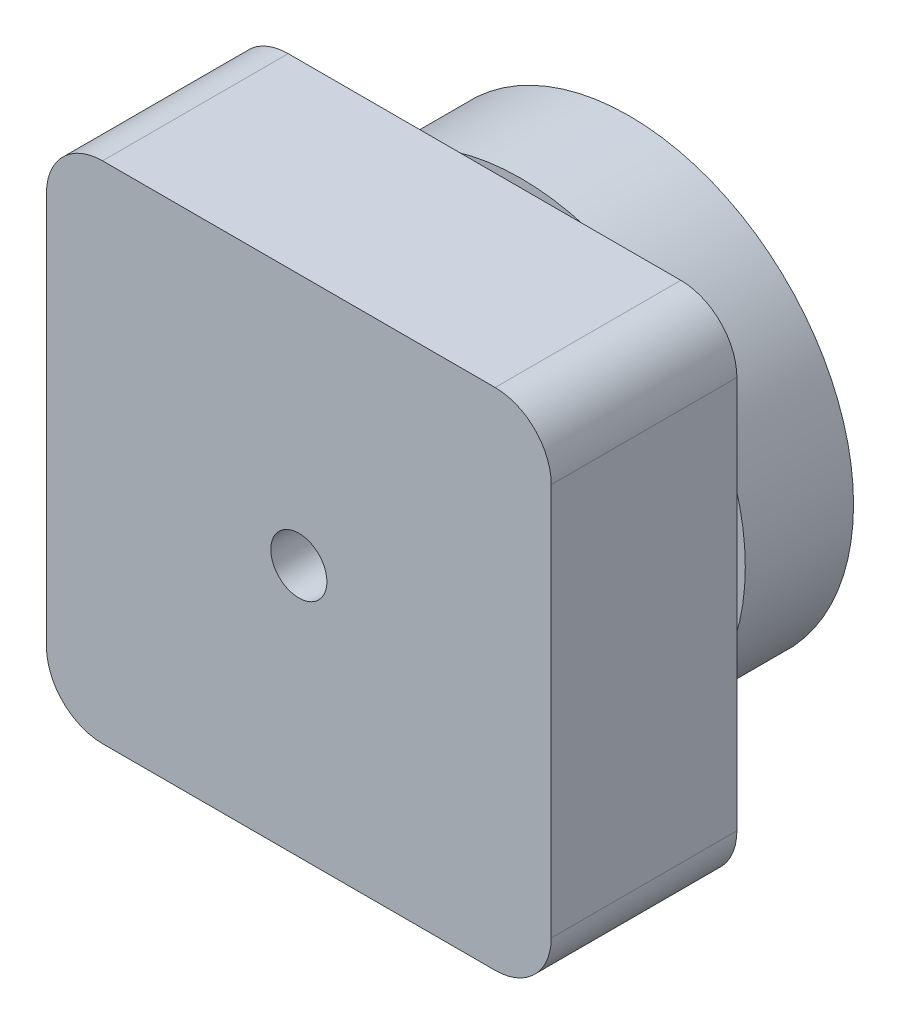
ISO-10303-21;
HEADER;
FILE_DESCRIPTION(('STEP AP214'),'2;1');
FILE_NAME('part.step','',(''),(''),'','','');
FILE_SCHEMA(('AUTOMOTIVE_DESIGN { 1 0 10303 214 1 1 1 1 }'));
ENDSEC;
DATA;
#1=APPLICATION_CONTEXT('core data for automotive mechanical design processes');
#2=APPLICATION_PROTOCOL_DEFINITION('international standard','automotive_design',2000,#1);
#3=PRODUCT_CONTEXT('',#1,'mechanical');
#4=PRODUCT('Part','Part','',(#3));
#5=PRODUCT_RELATED_PRODUCT_CATEGORY('part','',(#4));
#6=PRODUCT_DEFINITION_FORMATION('','',#4);
#7=PRODUCT_DEFINITION_CONTEXT('part definition',#1,'design');
#8=PRODUCT_DEFINITION('design','',#6,#7);
#9=PRODUCT_DEFINITION_SHAPE('','',#8);
#10=(LENGTH_UNIT() NAMED_UNIT(*) SI_UNIT(.MILLI.,.METRE.));
#11=(NAMED_UNIT(*) PLANE_ANGLE_UNIT() SI_UNIT($,.RADIAN.));
#12=(NAMED_UNIT(*) SI_UNIT($,.STERADIAN.) SOLID_ANGLE_UNIT());
#13=UNCERTAINTY_MEASURE_WITH_UNIT(LENGTH_MEASURE(1.E-05),#10,'distance_accuracy_value','');
#14=(GEOMETRIC_REPRESENTATION_CONTEXT(3) GLOBAL_UNCERTAINTY_ASSIGNED_CONTEXT((#13)) GLOBAL_UNIT_ASSIGNED_CONTEXT((#10,
#11,#12)) REPRESENTATION_CONTEXT('',''));
#15=CARTESIAN_POINT('',(0.,0.,0.));
#16=DIRECTION('',(0.,0.,1.));
#17=DIRECTION('',(1.,0.,0.));
#18=AXIS2_PLACEMENT_3D('',#15,#16,#17);
#19=CARTESIAN_POINT('',(40.,0.,-6.5));
#20=DIRECTION('',(0.,0.,1.));
#21=DIRECTION('',(0.,-1.,0.));
#22=AXIS2_PLACEMENT_3D('',#19,#20,#21);
#23=PLANE('',#22);
#24=CARTESIAN_POINT('',(0.,0.,-6.5));
#25=DIRECTION('',(0.,0.,-1.));
#26=DIRECTION('',(0.,1.,0.));
#27=AXIS2_PLACEMENT_3D('',#24,#25,#26);
#28=CIRCLE('',#27,40.);
#29=CARTESIAN_POINT('',(0.,40.,-6.5));
#30=VERTEX_POINT('',#29);
#31=EDGE_CURVE('E190',#30,#30,#28,.T.);
#32=ORIENTED_EDGE('',*,*,#31,.F.);
#33=EDGE_LOOP('',(#32));
#34=FACE_BOUND('',#33,.T.);
#35=CARTESIAN_POINT('',(0.,0.,-6.5));
#36=DIRECTION('',(0.,0.,1.));
#37=DIRECTION('',(1.,0.,0.));
#38=AXIS2_PLACEMENT_3D('',#35,#36,#37);
#39=CIRCLE('',#38,20.);
#40=CARTESIAN_POINT('',(20.,0.,-6.5));
#41=VERTEX_POINT('',#40);
#42=EDGE_CURVE('E181',#41,#41,#39,.T.);
#43=ORIENTED_EDGE('',*,*,#42,.F.);
#44=EDGE_LOOP('',(#43));
#45=FACE_BOUND('',#44,.T.);
#46=ADVANCED_FACE('F36',(#34,#45),#23,.T.);
#47=CARTESIAN_POINT('',(0.,0.,-6.5));
#48=DIRECTION('',(0.,0.,-1.));
#49=DIRECTION('',(0.,1.,0.));
#50=AXIS2_PLACEMENT_3D('',#47,#48,#49);
#51=CYLINDRICAL_SURFACE('',#50,40.);
#52=ORIENTED_EDGE('',*,*,#31,.T.);
#53=EDGE_LOOP('',(#52));
#54=FACE_BOUND('',#53,.T.);
#55=CARTESIAN_POINT('',(0.,0.,-25.8));
#56=DIRECTION('',(0.,0.,-1.));
#57=DIRECTION('',(0.,1.,0.));
#58=AXIS2_PLACEMENT_3D('',#55,#56,#57);
#59=CIRCLE('',#58,40.);
#60=CARTESIAN_POINT('',(0.,40.,-25.8));
#61=VERTEX_POINT('',#60);
#62=EDGE_CURVE('E185',#61,#61,#59,.T.);
#63=ORIENTED_EDGE('',*,*,#62,.F.);
#64=EDGE_LOOP('',(#63));
#65=FACE_BOUND('',#64,.T.);
#66=ADVANCED_FACE('F253',(#54,#65),#51,.T.);
#67=CARTESIAN_POINT('',(0.,0.,-25.8));
#68=DIRECTION('',(0.,0.,-1.));
#69=DIRECTION('',(0.,1.,0.));
#70=AXIS2_PLACEMENT_3D('',#67,#68,#69);
#71=PLANE('',#70);
#72=CARTESIAN_POINT('',(0.,0.,-25.8));
#73=DIRECTION('',(0.,0.,1.));
#74=DIRECTION('',(1.,0.,0.));
#75=AXIS2_PLACEMENT_3D('',#72,#73,#74);
#76=CIRCLE('',#75,5.);
#77=CARTESIAN_POINT('',(5.,0.,-25.8));
#78=VERTEX_POINT('',#77);
#79=EDGE_CURVE('E178',#78,#78,#76,.T.);
#80=ORIENTED_EDGE('',*,*,#79,.T.);
#81=EDGE_LOOP('',(#80));
#82=FACE_BOUND('',#81,.T.);
#83=ORIENTED_EDGE('',*,*,#62,.T.);
#84=EDGE_LOOP('',(#83));
#85=FACE_BOUND('',#84,.T.);
#86=ADVANCED_FACE('F259',(#82,#85),#71,.T.);
#87=CARTESIAN_POINT('',(0.,0.,0.));
#88=DIRECTION('',(0.,0.,-1.));
#89=DIRECTION('',(-1.,0.,0.));
#90=AXIS2_PLACEMENT_3D('',#87,#88,#89);
#91=CYLINDRICAL_SURFACE('',#90,20.);
#92=CARTESIAN_POINT('',(0.,0.,0.));
#93=DIRECTION('',(0.,0.,1.));
#94=DIRECTION('',(1.,0.,0.));
#95=AXIS2_PLACEMENT_3D('',#92,#93,#94);
#96=CIRCLE('',#95,20.);
#97=CARTESIAN_POINT('',(20.,0.,0.));
#98=VERTEX_POINT('',#97);
#99=EDGE_CURVE('E182',#98,#98,#96,.T.);
#100=ORIENTED_EDGE('',*,*,#99,.F.);
#101=EDGE_LOOP('',(#100));
#102=FACE_BOUND('',#101,.T.);
#103=ORIENTED_EDGE('',*,*,#42,.T.);
#104=EDGE_LOOP('',(#103));
#105=FACE_BOUND('',#104,.T.);
#106=ADVANCED_FACE('F361',(#102,#105),#91,.T.);
#107=CARTESIAN_POINT('',(0.,0.,0.));
#108=DIRECTION('',(0.,0.,1.));
#109=DIRECTION('',(1.,0.,0.));
#110=AXIS2_PLACEMENT_3D('',#107,#108,#109);
#111=CYLINDRICAL_SURFACE('',#110,5.00000000000001);
#112=ORIENTED_EDGE('',*,*,#79,.F.);
#113=EDGE_LOOP('',(#112));
#114=FACE_BOUND('',#113,.T.);
#115=CARTESIAN_POINT('',(0.,0.,-4.));
#116=DIRECTION('',(0.,0.,1.));
#117=DIRECTION('',(1.,0.,0.));
#118=AXIS2_PLACEMENT_3D('',#115,#116,#117);
#119=CIRCLE('',#118,5.00000000000001);
#120=CARTESIAN_POINT('',(5.00000000000001,0.,-4.));
#121=VERTEX_POINT('',#120);
#122=EDGE_CURVE('E175',#121,#121,#119,.T.);
#123=ORIENTED_EDGE('',*,*,#122,.T.);
#124=EDGE_LOOP('',(#123));
#125=FACE_BOUND('',#124,.T.);
#126=ADVANCED_FACE('F358',(#114,#125),#111,.F.);
#127=CARTESIAN_POINT('',(5.00000000000001,0.,-4.));
#128=DIRECTION('',(0.,0.,-1.));
#129=DIRECTION('',(-1.,0.,0.));
#130=AXIS2_PLACEMENT_3D('',#127,#128,#129);
#131=PLANE('',#130);
#132=ORIENTED_EDGE('',*,*,#122,.F.);
#133=EDGE_LOOP('',(#132));
#134=FACE_BOUND('',#133,.T.);
#135=CARTESIAN_POINT('',(0.,0.,-4.));
#136=DIRECTION('',(0.,0.,1.));
#137=DIRECTION('',(1.,0.,0.));
#138=AXIS2_PLACEMENT_3D('',#135,#136,#137);
#139=CIRCLE('',#138,10.);
#140=CARTESIAN_POINT('',(10.,0.,-4.));
#141=VERTEX_POINT('',#140);
#142=EDGE_CURVE('E172',#141,#141,#139,.T.);
#143=ORIENTED_EDGE('',*,*,#142,.T.);
#144=EDGE_LOOP('',(#143));
#145=FACE_BOUND('',#144,.T.);
#146=ADVANCED_FACE('F354',(#134,#145),#131,.F.);
#147=CARTESIAN_POINT('',(0.,0.,0.));
#148=DIRECTION('',(0.,0.,1.));
#149=DIRECTION('',(1.,0.,0.));
#150=AXIS2_PLACEMENT_3D('',#147,#148,#149);
#151=CYLINDRICAL_SURFACE('',#150,10.);
#152=ORIENTED_EDGE('',*,*,#142,.F.);
#153=EDGE_LOOP('',(#152));
#154=FACE_BOUND('',#153,.T.);
#155=CARTESIAN_POINT('',(0.,0.,0.));
#156=DIRECTION('',(0.,0.,-1.));
#157=DIRECTION('',(-1.,0.,0.));
#158=AXIS2_PLACEMENT_3D('',#155,#156,#157);
#159=CIRCLE('',#158,10.);
#160=CARTESIAN_POINT('',(-10.,0.,0.));
#161=VERTEX_POINT('',#160);
#162=EDGE_CURVE('E154',#161,#161,#159,.F.);
#163=ORIENTED_EDGE('',*,*,#162,.T.);
#164=EDGE_LOOP('',(#163));
#165=FACE_BOUND('',#164,.T.);
#166=ADVANCED_FACE('F293',(#154,#165),#151,.F.);
#167=CARTESIAN_POINT('',(0.,0.,0.));
#168=DIRECTION('',(0.,0.,-1.));
#169=DIRECTION('',(-1.,0.,0.));
#170=AXIS2_PLACEMENT_3D('',#167,#168,#169);
#171=PLANE('',#170);
#172=DIRECTION('',(1.,0.,0.));
#173=VECTOR('',#172,1.);
#174=CARTESIAN_POINT('',(-45.,-45.,0.));
#175=LINE('',#174,#173);
#176=CARTESIAN_POINT('',(-35.,-45.,0.));
#177=VERTEX_POINT('',#176);
#178=CARTESIAN_POINT('',(35.,-45.,0.));
#179=VERTEX_POINT('',#178);
#180=EDGE_CURVE('E120',#177,#179,#175,.T.);
#181=ORIENTED_EDGE('',*,*,#180,.F.);
#182=CARTESIAN_POINT('',(-35.,-35.,0.));
#183=DIRECTION('',(0.,0.,-1.));
#184=DIRECTION('',(-1.,0.,0.));
#185=AXIS2_PLACEMENT_3D('',#182,#183,#184);
#186=CIRCLE('',#185,10.);
#187=CARTESIAN_POINT('',(-45.,-35.,0.));
#188=VERTEX_POINT('',#187);
#189=EDGE_CURVE('E103',#177,#188,#186,.T.);
#190=ORIENTED_EDGE('',*,*,#189,.T.);
#191=DIRECTION('',(0.,-1.,0.));
#192=VECTOR('',#191,1.);
#193=CARTESIAN_POINT('',(-45.,-45.,0.));
#194=LINE('',#193,#192);
#195=CARTESIAN_POINT('',(-45.,35.,0.));
#196=VERTEX_POINT('',#195);
#197=EDGE_CURVE('E131',#196,#188,#194,.T.);
#198=ORIENTED_EDGE('',*,*,#197,.F.);
#199=CARTESIAN_POINT('',(-35.,35.,0.));
#200=DIRECTION('',(0.,0.,-1.));
#201=DIRECTION('',(-1.,0.,0.));
#202=AXIS2_PLACEMENT_3D('',#199,#200,#201);
#203=CIRCLE('',#202,10.);
#204=CARTESIAN_POINT('',(-35.,45.,0.));
#205=VERTEX_POINT('',#204);
#206=EDGE_CURVE('E124',#196,#205,#203,.T.);
#207=ORIENTED_EDGE('',*,*,#206,.T.);
#208=DIRECTION('',(-1.,0.,0.));
#209=VECTOR('',#208,1.);
#210=CARTESIAN_POINT('',(-45.,45.,0.));
#211=LINE('',#210,#209);
#212=CARTESIAN_POINT('',(35.,45.,0.));
#213=VERTEX_POINT('',#212);
#214=EDGE_CURVE('E135',#213,#205,#211,.T.);
#215=ORIENTED_EDGE('',*,*,#214,.F.);
#216=CARTESIAN_POINT('',(35.,35.,0.));
#217=DIRECTION('',(0.,0.,-1.));
#218=DIRECTION('',(-1.,0.,0.));
#219=AXIS2_PLACEMENT_3D('',#216,#217,#218);
#220=CIRCLE('',#219,10.);
#221=CARTESIAN_POINT('',(45.,35.,0.));
#222=VERTEX_POINT('',#221);
#223=EDGE_CURVE('E195',#213,#222,#220,.T.);
#224=ORIENTED_EDGE('',*,*,#223,.T.);
#225=DIRECTION('',(0.,1.,0.));
#226=VECTOR('',#225,1.);
#227=CARTESIAN_POINT('',(45.,-45.,0.));
#228=LINE('',#227,#226);
#229=CARTESIAN_POINT('',(45.,-35.,0.));
#230=VERTEX_POINT('',#229);
#231=EDGE_CURVE('E217',#230,#222,#228,.T.);
#232=ORIENTED_EDGE('',*,*,#231,.F.);
#233=CARTESIAN_POINT('',(35.,-35.,0.));
#234=DIRECTION('',(0.,0.,-1.));
#235=DIRECTION('',(-1.,0.,0.));
#236=AXIS2_PLACEMENT_3D('',#233,#234,#235);
#237=CIRCLE('',#236,10.);
#238=EDGE_CURVE('E114',#230,#179,#237,.T.);
#239=ORIENTED_EDGE('',*,*,#238,.T.);
#240=EDGE_LOOP('',(#181,#190,#198,#207,#215,#224,#232,#239));
#241=FACE_BOUND('',#240,.T.);
#242=ORIENTED_EDGE('',*,*,#99,.T.);
#243=EDGE_LOOP('',(#242));
#244=FACE_BOUND('',#243,.T.);
#245=ADVANCED_FACE('F127',(#241,#244),#171,.T.);
#246=CARTESIAN_POINT('',(0.,0.,0.));
#247=DIRECTION('',(0.,0.,1.));
#248=DIRECTION('',(1.,0.,0.));
#249=AXIS2_PLACEMENT_3D('',#246,#247,#248);
#250=CIRCLE('',#249,5.00000000000002);
#251=CARTESIAN_POINT('',(5.00000000000001,0.,0.));
#252=VERTEX_POINT('',#251);
#253=EDGE_CURVE('E225',#252,#252,#250,.T.);
#254=ORIENTED_EDGE('',*,*,#253,.T.);
#255=EDGE_LOOP('',(#254));
#256=FACE_BOUND('',#255,.T.);
#257=ORIENTED_EDGE('',*,*,#162,.F.);
#258=EDGE_LOOP('',(#257));
#259=FACE_BOUND('',#258,.T.);
#260=ADVANCED_FACE('F236',(#256,#259),#171,.T.);
#261=CARTESIAN_POINT('',(0.,0.,33.1));
#262=DIRECTION('',(0.,0.,-1.));
#263=DIRECTION('',(-1.,0.,0.));
#264=AXIS2_PLACEMENT_3D('',#261,#262,#263);
#265=PLANE('',#264);
#266=DIRECTION('',(0.,-1.,0.));
#267=VECTOR('',#266,1.);
#268=CARTESIAN_POINT('',(-45.,-45.,33.1));
#269=LINE('',#268,#267);
#270=CARTESIAN_POINT('',(-45.,35.,33.1));
#271=VERTEX_POINT('',#270);
#272=CARTESIAN_POINT('',(-45.,-35.,33.1));
#273=VERTEX_POINT('',#272);
#274=EDGE_CURVE('E229',#271,#273,#269,.T.);
#275=ORIENTED_EDGE('',*,*,#274,.T.);
#276=CARTESIAN_POINT('',(-35.,-35.,33.1));
#277=DIRECTION('',(0.,0.,-1.));
#278=DIRECTION('',(-1.,0.,0.));
#279=AXIS2_PLACEMENT_3D('',#276,#277,#278);
#280=CIRCLE('',#279,10.);
#281=CARTESIAN_POINT('',(-35.,-45.,33.1));
#282=VERTEX_POINT('',#281);
#283=EDGE_CURVE('E206',#273,#282,#280,.F.);
#284=ORIENTED_EDGE('',*,*,#283,.T.);
#285=DIRECTION('',(1.,0.,0.));
#286=VECTOR('',#285,1.);
#287=CARTESIAN_POINT('',(-45.,-45.,33.1));
#288=LINE('',#287,#286);
#289=CARTESIAN_POINT('',(35.,-45.,33.1));
#290=VERTEX_POINT('',#289);
#291=EDGE_CURVE('E123',#282,#290,#288,.T.);
#292=ORIENTED_EDGE('',*,*,#291,.T.);
#293=CARTESIAN_POINT('',(35.,-35.,33.1));
#294=DIRECTION('',(0.,0.,-1.));
#295=DIRECTION('',(-1.,0.,0.));
#296=AXIS2_PLACEMENT_3D('',#293,#294,#295);
#297=CIRCLE('',#296,10.);
#298=CARTESIAN_POINT('',(45.,-35.,33.1));
#299=VERTEX_POINT('',#298);
#300=EDGE_CURVE('E204',#290,#299,#297,.F.);
#301=ORIENTED_EDGE('',*,*,#300,.T.);
#302=DIRECTION('',(0.,1.,0.));
#303=VECTOR('',#302,1.);
#304=CARTESIAN_POINT('',(45.,-45.,33.1));
#305=LINE('',#304,#303);
#306=CARTESIAN_POINT('',(45.,35.,33.1));
#307=VERTEX_POINT('',#306);
#308=EDGE_CURVE('E130',#299,#307,#305,.T.);
#309=ORIENTED_EDGE('',*,*,#308,.T.);
#310=CARTESIAN_POINT('',(35.,35.,33.1));
#311=DIRECTION('',(0.,0.,-1.));
#312=DIRECTION('',(-1.,0.,0.));
#313=AXIS2_PLACEMENT_3D('',#310,#311,#312);
#314=CIRCLE('',#313,10.);
#315=CARTESIAN_POINT('',(35.,45.,33.1));
#316=VERTEX_POINT('',#315);
#317=EDGE_CURVE('E58',#307,#316,#314,.F.);
#318=ORIENTED_EDGE('',*,*,#317,.T.);
#319=DIRECTION('',(-1.,0.,0.));
#320=VECTOR('',#319,1.);
#321=CARTESIAN_POINT('',(-45.,45.,33.1));
#322=LINE('',#321,#320);
#323=CARTESIAN_POINT('',(-35.,45.,33.1));
#324=VERTEX_POINT('',#323);
#325=EDGE_CURVE('E133',#316,#324,#322,.T.);
#326=ORIENTED_EDGE('',*,*,#325,.T.);
#327=CARTESIAN_POINT('',(-35.,35.,33.1));
#328=DIRECTION('',(0.,0.,-1.));
#329=DIRECTION('',(-1.,0.,0.));
#330=AXIS2_PLACEMENT_3D('',#327,#328,#329);
#331=CIRCLE('',#330,10.);
#332=EDGE_CURVE('E201',#324,#271,#331,.F.);
#333=ORIENTED_EDGE('',*,*,#332,.T.);
#334=EDGE_LOOP('',(#275,#284,#292,#301,#309,#318,#326,#333));
#335=FACE_BOUND('',#334,.T.);
#336=CARTESIAN_POINT('',(0.,0.,33.1));
#337=DIRECTION('',(0.,0.,1.));
#338=DIRECTION('',(1.,0.,0.));
#339=AXIS2_PLACEMENT_3D('',#336,#337,#338);
#340=CIRCLE('',#339,5.00000000000002);
#341=CARTESIAN_POINT('',(5.00000000000001,0.,33.1));
#342=VERTEX_POINT('',#341);
#343=EDGE_CURVE('E222',#342,#342,#340,.T.);
#344=ORIENTED_EDGE('',*,*,#343,.F.);
#345=EDGE_LOOP('',(#344));
#346=FACE_BOUND('',#345,.T.);
#347=ADVANCED_FACE('F281',(#335,#346),#265,.F.);
#348=CARTESIAN_POINT('',(45.,-45.,33.1));
#349=DIRECTION('',(-1.,0.,0.));
#350=DIRECTION('',(0.,0.,1.));
#351=AXIS2_PLACEMENT_3D('',#348,#349,#350);
#352=PLANE('',#351);
#353=ORIENTED_EDGE('',*,*,#308,.F.);
#354=DIRECTION('',(0.,0.,-1.));
#355=VECTOR('',#354,1.);
#356=CARTESIAN_POINT('',(45.,-35.,33.1));
#357=LINE('',#356,#355);
#358=EDGE_CURVE('E210',#299,#230,#357,.T.);
#359=ORIENTED_EDGE('',*,*,#358,.T.);
#360=ORIENTED_EDGE('',*,*,#231,.T.);
#361=DIRECTION('',(0.,0.,-1.));
#362=VECTOR('',#361,1.);
#363=CARTESIAN_POINT('',(45.,35.,33.1));
#364=LINE('',#363,#362);
#365=EDGE_CURVE('E208',#222,#307,#364,.F.);
#366=ORIENTED_EDGE('',*,*,#365,.T.);
#367=EDGE_LOOP('',(#353,#359,#360,#366));
#368=FACE_BOUND('',#367,.T.);
#369=ADVANCED_FACE('F216',(#368),#352,.F.);
#370=CARTESIAN_POINT('',(-45.,45.,33.1));
#371=DIRECTION('',(0.,-1.,0.));
#372=DIRECTION('',(0.,0.,-1.));
#373=AXIS2_PLACEMENT_3D('',#370,#371,#372);
#374=PLANE('',#373);
#375=ORIENTED_EDGE('',*,*,#325,.F.);
#376=DIRECTION('',(0.,0.,-1.));
#377=VECTOR('',#376,1.);
#378=CARTESIAN_POINT('',(35.,45.,33.1));
#379=LINE('',#378,#377);
#380=EDGE_CURVE('E11',#316,#213,#379,.T.);
#381=ORIENTED_EDGE('',*,*,#380,.T.);
#382=ORIENTED_EDGE('',*,*,#214,.T.);
#383=DIRECTION('',(0.,0.,-1.));
#384=VECTOR('',#383,1.);
#385=CARTESIAN_POINT('',(-35.,45.,33.1));
#386=LINE('',#385,#384);
#387=EDGE_CURVE('E45',#205,#324,#386,.F.);
#388=ORIENTED_EDGE('',*,*,#387,.T.);
#389=EDGE_LOOP('',(#375,#381,#382,#388));
#390=FACE_BOUND('',#389,.T.);
#391=ADVANCED_FACE('F276',(#390),#374,.F.);
#392=CARTESIAN_POINT('',(-45.,-45.,33.1));
#393=DIRECTION('',(1.,0.,0.));
#394=DIRECTION('',(0.,0.,-1.));
#395=AXIS2_PLACEMENT_3D('',#392,#393,#394);
#396=PLANE('',#395);
#397=ORIENTED_EDGE('',*,*,#197,.T.);
#398=DIRECTION('',(0.,0.,-1.));
#399=VECTOR('',#398,1.);
#400=CARTESIAN_POINT('',(-45.,-35.,33.1));
#401=LINE('',#400,#399);
#402=EDGE_CURVE('E108',#188,#273,#401,.F.);
#403=ORIENTED_EDGE('',*,*,#402,.T.);
#404=ORIENTED_EDGE('',*,*,#274,.F.);
#405=DIRECTION('',(0.,0.,-1.));
#406=VECTOR('',#405,1.);
#407=CARTESIAN_POINT('',(-45.,35.,33.1));
#408=LINE('',#407,#406);
#409=EDGE_CURVE('E113',#271,#196,#408,.T.);
#410=ORIENTED_EDGE('',*,*,#409,.T.);
#411=EDGE_LOOP('',(#397,#403,#404,#410));
#412=FACE_BOUND('',#411,.T.);
#413=ADVANCED_FACE('F249',(#412),#396,.F.);
#414=CARTESIAN_POINT('',(-45.,-45.,33.1));
#415=DIRECTION('',(0.,1.,0.));
#416=DIRECTION('',(0.,0.,1.));
#417=AXIS2_PLACEMENT_3D('',#414,#415,#416);
#418=PLANE('',#417);
#419=ORIENTED_EDGE('',*,*,#291,.F.);
#420=DIRECTION('',(0.,0.,-1.));
#421=VECTOR('',#420,1.);
#422=CARTESIAN_POINT('',(-35.,-45.,33.1));
#423=LINE('',#422,#421);
#424=EDGE_CURVE('E107',#282,#177,#423,.T.);
#425=ORIENTED_EDGE('',*,*,#424,.T.);
#426=ORIENTED_EDGE('',*,*,#180,.T.);
#427=DIRECTION('',(0.,0.,-1.));
#428=VECTOR('',#427,1.);
#429=CARTESIAN_POINT('',(35.,-45.,33.1));
#430=LINE('',#429,#428);
#431=EDGE_CURVE('E125',#179,#290,#430,.F.);
#432=ORIENTED_EDGE('',*,*,#431,.T.);
#433=EDGE_LOOP('',(#419,#425,#426,#432));
#434=FACE_BOUND('',#433,.T.);
#435=ADVANCED_FACE('F119',(#434),#418,.F.);
#436=CARTESIAN_POINT('',(0.,0.,33.1));
#437=DIRECTION('',(0.,0.,-1.));
#438=DIRECTION('',(-1.,0.,0.));
#439=AXIS2_PLACEMENT_3D('',#436,#437,#438);
#440=CYLINDRICAL_SURFACE('',#439,5.00000000000002);
#441=ORIENTED_EDGE('',*,*,#343,.T.);
#442=EDGE_LOOP('',(#441));
#443=FACE_BOUND('',#442,.T.);
#444=ORIENTED_EDGE('',*,*,#253,.F.);
#445=EDGE_LOOP('',(#444));
#446=FACE_BOUND('',#445,.T.);
#447=ADVANCED_FACE('F239',(#443,#446),#440,.F.);
#448=CARTESIAN_POINT('',(-35.,-35.,33.1));
#449=DIRECTION('',(0.,0.,-1.));
#450=DIRECTION('',(-1.,0.,0.));
#451=AXIS2_PLACEMENT_3D('',#448,#449,#450);
#452=CYLINDRICAL_SURFACE('',#451,10.);
#453=ORIENTED_EDGE('',*,*,#283,.F.);
#454=ORIENTED_EDGE('',*,*,#402,.F.);
#455=ORIENTED_EDGE('',*,*,#189,.F.);
#456=ORIENTED_EDGE('',*,*,#424,.F.);
#457=EDGE_LOOP('',(#453,#454,#455,#456));
#458=FACE_BOUND('',#457,.T.);
#459=ADVANCED_FACE('F106',(#458),#452,.T.);
#460=CARTESIAN_POINT('',(35.,-35.,33.1));
#461=DIRECTION('',(0.,0.,-1.));
#462=DIRECTION('',(-1.,0.,0.));
#463=AXIS2_PLACEMENT_3D('',#460,#461,#462);
#464=CYLINDRICAL_SURFACE('',#463,10.);
#465=ORIENTED_EDGE('',*,*,#300,.F.);
#466=ORIENTED_EDGE('',*,*,#431,.F.);
#467=ORIENTED_EDGE('',*,*,#238,.F.);
#468=ORIENTED_EDGE('',*,*,#358,.F.);
#469=EDGE_LOOP('',(#465,#466,#467,#468));
#470=FACE_BOUND('',#469,.T.);
#471=ADVANCED_FACE('F247',(#470),#464,.T.);
#472=CARTESIAN_POINT('',(35.,35.,33.1));
#473=DIRECTION('',(0.,0.,-1.));
#474=DIRECTION('',(-1.,0.,0.));
#475=AXIS2_PLACEMENT_3D('',#472,#473,#474);
#476=CYLINDRICAL_SURFACE('',#475,10.);
#477=ORIENTED_EDGE('',*,*,#317,.F.);
#478=ORIENTED_EDGE('',*,*,#365,.F.);
#479=ORIENTED_EDGE('',*,*,#223,.F.);
#480=ORIENTED_EDGE('',*,*,#380,.F.);
#481=EDGE_LOOP('',(#477,#478,#479,#480));
#482=FACE_BOUND('',#481,.T.);
#483=ADVANCED_FACE('F268',(#482),#476,.T.);
#484=CARTESIAN_POINT('',(-35.,35.,33.1));
#485=DIRECTION('',(0.,0.,-1.));
#486=DIRECTION('',(-1.,0.,0.));
#487=AXIS2_PLACEMENT_3D('',#484,#485,#486);
#488=CYLINDRICAL_SURFACE('',#487,10.);
#489=ORIENTED_EDGE('',*,*,#332,.F.);
#490=ORIENTED_EDGE('',*,*,#387,.F.);
#491=ORIENTED_EDGE('',*,*,#206,.F.);
#492=ORIENTED_EDGE('',*,*,#409,.F.);
#493=EDGE_LOOP('',(#489,#490,#491,#492));
#494=FACE_BOUND('',#493,.T.);
#495=ADVANCED_FACE('F38',(#494),#488,.T.);
#496=CLOSED_SHELL('',(#46,#66,#86,#106,#126,#146,#166,#245,#260,#347,#369,#391,#413,#435,#447,
#459,#471,#483,#495));
#497=CARTESIAN_POINT('',(11.136931804,11.136931804,-7.99999999999999));
#498=DIRECTION('',(0.,0.,-1.));
#499=DIRECTION('',(-1.,0.,0.));
#500=AXIS2_PLACEMENT_3D('',#497,#498,#499);
#501=PLANE('',#500);
#502=CARTESIAN_POINT('',(11.136931804,11.136931804,-7.99999999999999));
#503=DIRECTION('',(0.,0.,1.));
#504=DIRECTION('',(1.,0.,0.));
#505=AXIS2_PLACEMENT_3D('',#502,#503,#504);
#506=CIRCLE('',#505,2.49999999999999);
#507=CARTESIAN_POINT('',(13.636931804,11.136931804,-7.99999999999999));
#508=VERTEX_POINT('',#507);
#509=EDGE_CURVE('E169',#508,#508,#506,.T.);
#510=ORIENTED_EDGE('',*,*,#509,.T.);
#511=EDGE_LOOP('',(#510));
#512=FACE_BOUND('',#511,.T.);
#513=ADVANCED_FACE('F346',(#512),#501,.F.);
#514=CARTESIAN_POINT('',(11.136931804,11.136931804,0.));
#515=DIRECTION('',(0.,0.,1.));
#516=DIRECTION('',(1.,0.,0.));
#517=AXIS2_PLACEMENT_3D('',#514,#515,#516);
#518=CYLINDRICAL_SURFACE('',#517,2.49999999999999);
#519=ORIENTED_EDGE('',*,*,#509,.F.);
#520=EDGE_LOOP('',(#519));
#521=FACE_BOUND('',#520,.T.);
#522=CARTESIAN_POINT('',(11.136931804,11.136931804,0.));
#523=DIRECTION('',(0.,0.,-1.));
#524=DIRECTION('',(-1.,0.,0.));
#525=AXIS2_PLACEMENT_3D('',#522,#523,#524);
#526=CIRCLE('',#525,2.49999999999999);
#527=CARTESIAN_POINT('',(8.63693180400001,11.136931804,0.));
#528=VERTEX_POINT('',#527);
#529=EDGE_CURVE('E151',#528,#528,#526,.F.);
#530=ORIENTED_EDGE('',*,*,#529,.T.);
#531=EDGE_LOOP('',(#530));
#532=FACE_BOUND('',#531,.T.);
#533=ADVANCED_FACE('F343',(#521,#532),#518,.F.);
#534=ORIENTED_EDGE('',*,*,#529,.F.);
#535=EDGE_LOOP('',(#534));
#536=FACE_BOUND('',#535,.T.);
#537=ADVANCED_FACE('F291',(#536),#171,.T.);
#538=CLOSED_SHELL('',(#513,#533,#537));
#539=CARTESIAN_POINT('',(11.136931804,-11.136931804,-7.99999999999999));
#540=DIRECTION('',(0.,0.,-1.));
#541=DIRECTION('',(-1.,0.,0.));
#542=AXIS2_PLACEMENT_3D('',#539,#540,#541);
#543=PLANE('',#542);
#544=CARTESIAN_POINT('',(11.136931804,-11.136931804,-7.99999999999999));
#545=DIRECTION('',(0.,0.,1.));
#546=DIRECTION('',(1.,0.,0.));
#547=AXIS2_PLACEMENT_3D('',#544,#545,#546);
#548=CIRCLE('',#547,2.49999999999999);
#549=CARTESIAN_POINT('',(13.636931804,-11.136931804,-7.99999999999999));
#550=VERTEX_POINT('',#549);
#551=EDGE_CURVE('E166',#550,#550,#548,.T.);
#552=ORIENTED_EDGE('',*,*,#551,.T.);
#553=EDGE_LOOP('',(#552));
#554=FACE_BOUND('',#553,.T.);
#555=ADVANCED_FACE('F336',(#554),#543,.F.);
#556=CARTESIAN_POINT('',(11.136931804,-11.136931804,0.));
#557=DIRECTION('',(0.,0.,1.));
#558=DIRECTION('',(1.,0.,0.));
#559=AXIS2_PLACEMENT_3D('',#556,#557,#558);
#560=CYLINDRICAL_SURFACE('',#559,2.49999999999999);
#561=ORIENTED_EDGE('',*,*,#551,.F.);
#562=EDGE_LOOP('',(#561));
#563=FACE_BOUND('',#562,.T.);
#564=CARTESIAN_POINT('',(11.136931804,-11.136931804,0.));
#565=DIRECTION('',(0.,0.,-1.));
#566=DIRECTION('',(-1.,0.,0.));
#567=AXIS2_PLACEMENT_3D('',#564,#565,#566);
#568=CIRCLE('',#567,2.49999999999999);
#569=CARTESIAN_POINT('',(8.63693180400001,-11.136931804,0.));
#570=VERTEX_POINT('',#569);
#571=EDGE_CURVE('E148',#570,#570,#568,.F.);
#572=ORIENTED_EDGE('',*,*,#571,.T.);
#573=EDGE_LOOP('',(#572));
#574=FACE_BOUND('',#573,.T.);
#575=ADVANCED_FACE('F332',(#563,#574),#560,.F.);
#576=ORIENTED_EDGE('',*,*,#571,.F.);
#577=EDGE_LOOP('',(#576));
#578=FACE_BOUND('',#577,.T.);
#579=ADVANCED_FACE('F335',(#578),#171,.T.);
#580=CLOSED_SHELL('',(#555,#575,#579));
#581=CARTESIAN_POINT('',(-11.136931804,-11.136931804,-7.99999999999999));
#582=DIRECTION('',(0.,0.,-1.));
#583=DIRECTION('',(-1.,0.,0.));
#584=AXIS2_PLACEMENT_3D('',#581,#582,#583);
#585=PLANE('',#584);
#586=CARTESIAN_POINT('',(-11.136931804,-11.136931804,-7.99999999999999));
#587=DIRECTION('',(0.,0.,1.));
#588=DIRECTION('',(1.,0.,0.));
#589=AXIS2_PLACEMENT_3D('',#586,#587,#588);
#590=CIRCLE('',#589,2.49999999999999);
#591=CARTESIAN_POINT('',(-8.63693180400001,-11.136931804,-7.99999999999999));
#592=VERTEX_POINT('',#591);
#593=EDGE_CURVE('E163',#592,#592,#590,.T.);
#594=ORIENTED_EDGE('',*,*,#593,.T.);
#595=EDGE_LOOP('',(#594));
#596=FACE_BOUND('',#595,.T.);
#597=ADVANCED_FACE('F325',(#596),#585,.F.);
#598=CARTESIAN_POINT('',(-11.136931804,-11.136931804,0.));
#599=DIRECTION('',(0.,0.,1.));
#600=DIRECTION('',(1.,0.,0.));
#601=AXIS2_PLACEMENT_3D('',#598,#599,#600);
#602=CYLINDRICAL_SURFACE('',#601,2.49999999999999);
#603=ORIENTED_EDGE('',*,*,#593,.F.);
#604=EDGE_LOOP('',(#603));
#605=FACE_BOUND('',#604,.T.);
#606=CARTESIAN_POINT('',(-11.136931804,-11.136931804,0.));
#607=DIRECTION('',(0.,0.,-1.));
#608=DIRECTION('',(-1.,0.,0.));
#609=AXIS2_PLACEMENT_3D('',#606,#607,#608);
#610=CIRCLE('',#609,2.49999999999999);
#611=CARTESIAN_POINT('',(-13.636931804,-11.136931804,0.));
#612=VERTEX_POINT('',#611);
#613=EDGE_CURVE('E145',#612,#612,#610,.F.);
#614=ORIENTED_EDGE('',*,*,#613,.T.);
#615=EDGE_LOOP('',(#614));
#616=FACE_BOUND('',#615,.T.);
#617=ADVANCED_FACE('F321',(#605,#616),#602,.F.);
#618=ORIENTED_EDGE('',*,*,#613,.F.);
#619=EDGE_LOOP('',(#618));
#620=FACE_BOUND('',#619,.T.);
#621=ADVANCED_FACE('F324',(#620),#171,.T.);
#622=CLOSED_SHELL('',(#597,#617,#621));
#623=CARTESIAN_POINT('',(-11.136931804,11.136931804,-7.99999999999999));
#624=DIRECTION('',(0.,0.,-1.));
#625=DIRECTION('',(-1.,0.,0.));
#626=AXIS2_PLACEMENT_3D('',#623,#624,#625);
#627=PLANE('',#626);
#628=CARTESIAN_POINT('',(-11.136931804,11.136931804,-7.99999999999999));
#629=DIRECTION('',(0.,0.,1.));
#630=DIRECTION('',(1.,0.,0.));
#631=AXIS2_PLACEMENT_3D('',#628,#629,#630);
#632=CIRCLE('',#631,2.49999999999999);
#633=CARTESIAN_POINT('',(-8.63693180400001,11.136931804,-7.99999999999999));
#634=VERTEX_POINT('',#633);
#635=EDGE_CURVE('E160',#634,#634,#632,.T.);
#636=ORIENTED_EDGE('',*,*,#635,.T.);
#637=EDGE_LOOP('',(#636));
#638=FACE_BOUND('',#637,.T.);
#639=ADVANCED_FACE('F314',(#638),#627,.F.);
#640=CARTESIAN_POINT('',(-11.136931804,11.136931804,0.));
#641=DIRECTION('',(0.,0.,1.));
#642=DIRECTION('',(1.,0.,0.));
#643=AXIS2_PLACEMENT_3D('',#640,#641,#642);
#644=CYLINDRICAL_SURFACE('',#643,2.49999999999999);
#645=ORIENTED_EDGE('',*,*,#635,.F.);
#646=EDGE_LOOP('',(#645));
#647=FACE_BOUND('',#646,.T.);
#648=CARTESIAN_POINT('',(-11.136931804,11.136931804,0.));
#649=DIRECTION('',(0.,0.,-1.));
#650=DIRECTION('',(-1.,0.,0.));
#651=AXIS2_PLACEMENT_3D('',#648,#649,#650);
#652=CIRCLE('',#651,2.49999999999999);
#653=CARTESIAN_POINT('',(-13.636931804,11.136931804,0.));
#654=VERTEX_POINT('',#653);
#655=EDGE_CURVE('E142',#654,#654,#652,.F.);
#656=ORIENTED_EDGE('',*,*,#655,.T.);
#657=EDGE_LOOP('',(#656));
#658=FACE_BOUND('',#657,.T.);
#659=ADVANCED_FACE('F310',(#647,#658),#644,.F.);
#660=ORIENTED_EDGE('',*,*,#655,.F.);
#661=EDGE_LOOP('',(#660));
#662=FACE_BOUND('',#661,.T.);
#663=ADVANCED_FACE('F313',(#662),#171,.T.);
#664=CLOSED_SHELL('',(#639,#659,#663));
#665=CARTESIAN_POINT('',(-15.75,0.,-7.99999999999999));
#666=DIRECTION('',(0.,0.,-1.));
#667=DIRECTION('',(-1.,0.,0.));
#668=AXIS2_PLACEMENT_3D('',#665,#666,#667);
#669=PLANE('',#668);
#670=CARTESIAN_POINT('',(-15.75,0.,-7.99999999999999));
#671=DIRECTION('',(0.,0.,1.));
#672=DIRECTION('',(1.,0.,0.));
#673=AXIS2_PLACEMENT_3D('',#670,#671,#672);
#674=CIRCLE('',#673,2.49999999999999);
#675=CARTESIAN_POINT('',(-13.25,0.,-7.99999999999999));
#676=VERTEX_POINT('',#675);
#677=EDGE_CURVE('E157',#676,#676,#674,.T.);
#678=ORIENTED_EDGE('',*,*,#677,.T.);
#679=EDGE_LOOP('',(#678));
#680=FACE_BOUND('',#679,.T.);
#681=ADVANCED_FACE('F303',(#680),#669,.F.);
#682=CARTESIAN_POINT('',(-15.75,0.,0.));
#683=DIRECTION('',(0.,0.,1.));
#684=DIRECTION('',(1.,0.,0.));
#685=AXIS2_PLACEMENT_3D('',#682,#683,#684);
#686=CYLINDRICAL_SURFACE('',#685,2.49999999999999);
#687=ORIENTED_EDGE('',*,*,#677,.F.);
#688=EDGE_LOOP('',(#687));
#689=FACE_BOUND('',#688,.T.);
#690=CARTESIAN_POINT('',(-15.75,0.,0.));
#691=DIRECTION('',(0.,0.,-1.));
#692=DIRECTION('',(-1.,0.,0.));
#693=AXIS2_PLACEMENT_3D('',#690,#691,#692);
#694=CIRCLE('',#693,2.49999999999999);
#695=CARTESIAN_POINT('',(-18.25,0.,0.));
#696=VERTEX_POINT('',#695);
#697=EDGE_CURVE('E139',#696,#696,#694,.F.);
#698=ORIENTED_EDGE('',*,*,#697,.T.);
#699=EDGE_LOOP('',(#698));
#700=FACE_BOUND('',#699,.T.);
#701=ADVANCED_FACE('F300',(#689,#700),#686,.F.);
#702=ORIENTED_EDGE('',*,*,#697,.F.);
#703=EDGE_LOOP('',(#702));
#704=FACE_BOUND('',#703,.T.);
#705=ADVANCED_FACE('F294',(#704),#171,.T.);
#706=CLOSED_SHELL('',(#681,#701,#705));
#707=ORIENTED_CLOSED_SHELL('',*,#538,.T.);
#708=ORIENTED_CLOSED_SHELL('',*,#580,.T.);
#709=ORIENTED_CLOSED_SHELL('',*,#622,.T.);
#710=ORIENTED_CLOSED_SHELL('',*,#664,.T.);
#711=ORIENTED_CLOSED_SHELL('',*,#706,.T.);
#712=BREP_WITH_VOIDS('B2',#496,(#707,#708,#709,#710,#711));
#713=ADVANCED_BREP_SHAPE_REPRESENTATION('',(#18,#712),#14);
#714=SHAPE_DEFINITION_REPRESENTATION(#9,#713);
ENDSEC;
END-ISO-10303-21;
